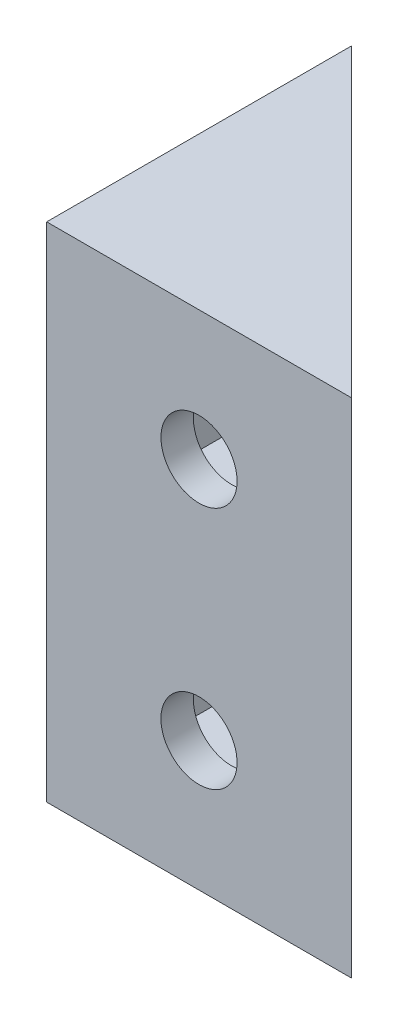
ISO-10303-21;
HEADER;
FILE_DESCRIPTION(('STEP AP214'),'2;1');
FILE_NAME('part.step','',(''),(''),'','','');
FILE_SCHEMA(('AUTOMOTIVE_DESIGN { 1 0 10303 214 1 1 1 1 }'));
ENDSEC;
DATA;
#1=APPLICATION_CONTEXT('core data for automotive mechanical design processes');
#2=APPLICATION_PROTOCOL_DEFINITION('international standard','automotive_design',2000,#1);
#3=PRODUCT_CONTEXT('',#1,'mechanical');
#4=PRODUCT('Part','Part','',(#3));
#5=PRODUCT_RELATED_PRODUCT_CATEGORY('part','',(#4));
#6=PRODUCT_DEFINITION_FORMATION('','',#4);
#7=PRODUCT_DEFINITION_CONTEXT('part definition',#1,'design');
#8=PRODUCT_DEFINITION('design','',#6,#7);
#9=PRODUCT_DEFINITION_SHAPE('','',#8);
#10=(LENGTH_UNIT() NAMED_UNIT(*) SI_UNIT(.MILLI.,.METRE.));
#11=(NAMED_UNIT(*) PLANE_ANGLE_UNIT() SI_UNIT($,.RADIAN.));
#12=(NAMED_UNIT(*) SI_UNIT($,.STERADIAN.) SOLID_ANGLE_UNIT());
#13=UNCERTAINTY_MEASURE_WITH_UNIT(LENGTH_MEASURE(1.E-05),#10,'distance_accuracy_value','');
#14=(GEOMETRIC_REPRESENTATION_CONTEXT(3) GLOBAL_UNCERTAINTY_ASSIGNED_CONTEXT((#13)) GLOBAL_UNIT_ASSIGNED_CONTEXT((#10,
#11,#12)) REPRESENTATION_CONTEXT('',''));
#15=CARTESIAN_POINT('',(0.,0.,0.));
#16=DIRECTION('',(0.,0.,1.));
#17=DIRECTION('',(1.,0.,0.));
#18=AXIS2_PLACEMENT_3D('',#15,#16,#17);
#19=CARTESIAN_POINT('',(3.,-16.5,-3.));
#20=DIRECTION('',(1.,0.,0.));
#21=DIRECTION('',(0.,0.,-1.));
#22=AXIS2_PLACEMENT_3D('',#19,#20,#21);
#23=PLANE('',#22);
#24=CARTESIAN_POINT('',(3.,8.,-10.));
#25=DIRECTION('',(1.,0.,0.));
#26=DIRECTION('',(0.,0.,-1.));
#27=AXIS2_PLACEMENT_3D('',#24,#25,#26);
#28=CIRCLE('',#27,4.00000000000002);
#29=CARTESIAN_POINT('',(3.,8.,-14.));
#30=VERTEX_POINT('',#29);
#31=EDGE_CURVE('E11',#30,#30,#28,.F.);
#32=ORIENTED_EDGE('',*,*,#31,.T.);
#33=EDGE_LOOP('',(#32));
#34=FACE_BOUND('',#33,.T.);
#35=DIRECTION('',(0.,1.,0.));
#36=VECTOR('',#35,1.);
#37=CARTESIAN_POINT('',(3.,-16.5,-3.));
#38=LINE('',#37,#36);
#39=CARTESIAN_POINT('',(3.,1.5,-3.));
#40=VERTEX_POINT('',#39);
#41=CARTESIAN_POINT('',(3.,13.5,-3.));
#42=VERTEX_POINT('',#41);
#43=EDGE_CURVE('E131',#40,#42,#38,.T.);
#44=ORIENTED_EDGE('',*,*,#43,.F.);
#45=DIRECTION('',(0.,0.,-1.));
#46=VECTOR('',#45,1.);
#47=CARTESIAN_POINT('',(3.,1.5,-3.));
#48=LINE('',#47,#46);
#49=CARTESIAN_POINT('',(3.,1.5,-17.));
#50=VERTEX_POINT('',#49);
#51=EDGE_CURVE('E50',#40,#50,#48,.T.);
#52=ORIENTED_EDGE('',*,*,#51,.T.);
#53=DIRECTION('',(0.,1.,0.));
#54=VECTOR('',#53,1.);
#55=CARTESIAN_POINT('',(3.,-16.5,-17.));
#56=LINE('',#55,#54);
#57=CARTESIAN_POINT('',(3.,13.5,-17.));
#58=VERTEX_POINT('',#57);
#59=EDGE_CURVE('E120',#50,#58,#56,.T.);
#60=ORIENTED_EDGE('',*,*,#59,.T.);
#61=DIRECTION('',(0.,0.,1.));
#62=VECTOR('',#61,1.);
#63=CARTESIAN_POINT('',(3.,13.5,-3.));
#64=LINE('',#63,#62);
#65=EDGE_CURVE('E209',#58,#42,#64,.T.);
#66=ORIENTED_EDGE('',*,*,#65,.T.);
#67=EDGE_LOOP('',(#44,#52,#60,#66));
#68=FACE_BOUND('',#67,.T.);
#69=ADVANCED_FACE('F35',(#34,#68),#23,.T.);
#70=CARTESIAN_POINT('',(17.,-16.5,-3.));
#71=DIRECTION('',(0.,0.,-1.));
#72=DIRECTION('',(-1.,0.,0.));
#73=AXIS2_PLACEMENT_3D('',#70,#71,#72);
#74=PLANE('',#73);
#75=CARTESIAN_POINT('',(10.,8.,-3.));
#76=DIRECTION('',(0.,0.,-1.));
#77=DIRECTION('',(-1.,0.,0.));
#78=AXIS2_PLACEMENT_3D('',#75,#76,#77);
#79=CIRCLE('',#78,4.);
#80=CARTESIAN_POINT('',(6.,8.,-3.));
#81=VERTEX_POINT('',#80);
#82=EDGE_CURVE('E141',#81,#81,#79,.F.);
#83=ORIENTED_EDGE('',*,*,#82,.T.);
#84=EDGE_LOOP('',(#83));
#85=FACE_BOUND('',#84,.T.);
#86=DIRECTION('',(0.,1.,0.));
#87=VECTOR('',#86,1.);
#88=CARTESIAN_POINT('',(17.,-16.5,-3.));
#89=LINE('',#88,#87);
#90=CARTESIAN_POINT('',(17.,1.5,-3.00000000000001));
#91=VERTEX_POINT('',#90);
#92=CARTESIAN_POINT('',(17.,13.5,-3.00000000000002));
#93=VERTEX_POINT('',#92);
#94=EDGE_CURVE('E118',#91,#93,#89,.T.);
#95=ORIENTED_EDGE('',*,*,#94,.F.);
#96=DIRECTION('',(-1.,0.,0.));
#97=VECTOR('',#96,1.);
#98=CARTESIAN_POINT('',(17.,1.5,-3.));
#99=LINE('',#98,#97);
#100=EDGE_CURVE('E104',#91,#40,#99,.T.);
#101=ORIENTED_EDGE('',*,*,#100,.T.);
#102=ORIENTED_EDGE('',*,*,#43,.T.);
#103=DIRECTION('',(1.,0.,0.));
#104=VECTOR('',#103,1.);
#105=CARTESIAN_POINT('',(17.,13.5,-3.));
#106=LINE('',#105,#104);
#107=EDGE_CURVE('E126',#42,#93,#106,.T.);
#108=ORIENTED_EDGE('',*,*,#107,.T.);
#109=EDGE_LOOP('',(#95,#101,#102,#108));
#110=FACE_BOUND('',#109,.T.);
#111=ADVANCED_FACE('F124',(#85,#110),#74,.T.);
#112=CARTESIAN_POINT('',(3.,-8.,-10.));
#113=DIRECTION('',(1.,0.,0.));
#114=DIRECTION('',(0.,0.,-1.));
#115=AXIS2_PLACEMENT_3D('',#112,#113,#114);
#116=CIRCLE('',#115,4.00000000000002);
#117=CARTESIAN_POINT('',(3.,-8.,-14.));
#118=VERTEX_POINT('',#117);
#119=EDGE_CURVE('E154',#118,#118,#116,.F.);
#120=ORIENTED_EDGE('',*,*,#119,.T.);
#121=EDGE_LOOP('',(#120));
#122=FACE_BOUND('',#121,.T.);
#123=DIRECTION('',(0.,0.,-1.));
#124=VECTOR('',#123,1.);
#125=CARTESIAN_POINT('',(3.,-1.5,-3.));
#126=LINE('',#125,#124);
#127=CARTESIAN_POINT('',(3.,-1.5,-3.));
#128=VERTEX_POINT('',#127);
#129=CARTESIAN_POINT('',(3.,-1.5,-17.));
#130=VERTEX_POINT('',#129);
#131=EDGE_CURVE('E195',#128,#130,#126,.T.);
#132=ORIENTED_EDGE('',*,*,#131,.F.);
#133=CARTESIAN_POINT('',(3.,-13.5,-3.));
#134=VERTEX_POINT('',#133);
#135=EDGE_CURVE('E135',#134,#128,#38,.T.);
#136=ORIENTED_EDGE('',*,*,#135,.F.);
#137=DIRECTION('',(0.,0.,1.));
#138=VECTOR('',#137,1.);
#139=CARTESIAN_POINT('',(3.,-13.5,-3.));
#140=LINE('',#139,#138);
#141=CARTESIAN_POINT('',(3.,-13.5,-17.));
#142=VERTEX_POINT('',#141);
#143=EDGE_CURVE('E285',#142,#134,#140,.T.);
#144=ORIENTED_EDGE('',*,*,#143,.F.);
#145=EDGE_CURVE('E198',#142,#130,#56,.T.);
#146=ORIENTED_EDGE('',*,*,#145,.T.);
#147=EDGE_LOOP('',(#132,#136,#144,#146));
#148=FACE_BOUND('',#147,.T.);
#149=ADVANCED_FACE('F174',(#122,#148),#23,.T.);
#150=CARTESIAN_POINT('',(10.,-8.,-3.));
#151=DIRECTION('',(0.,0.,-1.));
#152=DIRECTION('',(-1.,0.,0.));
#153=AXIS2_PLACEMENT_3D('',#150,#151,#152);
#154=CIRCLE('',#153,4.);
#155=CARTESIAN_POINT('',(6.,-8.,-3.));
#156=VERTEX_POINT('',#155);
#157=EDGE_CURVE('E148',#156,#156,#154,.F.);
#158=ORIENTED_EDGE('',*,*,#157,.T.);
#159=EDGE_LOOP('',(#158));
#160=FACE_BOUND('',#159,.T.);
#161=DIRECTION('',(-1.,0.,0.));
#162=VECTOR('',#161,1.);
#163=CARTESIAN_POINT('',(17.,-1.5,-3.));
#164=LINE('',#163,#162);
#165=CARTESIAN_POINT('',(17.,-1.5,-3.00000000000001));
#166=VERTEX_POINT('',#165);
#167=EDGE_CURVE('E202',#166,#128,#164,.T.);
#168=ORIENTED_EDGE('',*,*,#167,.F.);
#169=CARTESIAN_POINT('',(17.,-13.5,-3.));
#170=VERTEX_POINT('',#169);
#171=EDGE_CURVE('E127',#170,#166,#89,.T.);
#172=ORIENTED_EDGE('',*,*,#171,.F.);
#173=DIRECTION('',(1.,0.,0.));
#174=VECTOR('',#173,1.);
#175=CARTESIAN_POINT('',(17.,-13.5,-3.));
#176=LINE('',#175,#174);
#177=EDGE_CURVE('E58',#134,#170,#176,.T.);
#178=ORIENTED_EDGE('',*,*,#177,.F.);
#179=ORIENTED_EDGE('',*,*,#135,.T.);
#180=EDGE_LOOP('',(#168,#172,#178,#179));
#181=FACE_BOUND('',#180,.T.);
#182=ADVANCED_FACE('F181',(#160,#181),#74,.T.);
#183=CARTESIAN_POINT('',(0.,-16.5,0.));
#184=DIRECTION('',(0.,0.,1.));
#185=DIRECTION('',(1.,0.,0.));
#186=AXIS2_PLACEMENT_3D('',#183,#184,#185);
#187=PLANE('',#186);
#188=CARTESIAN_POINT('',(10.,-8.,0.));
#189=DIRECTION('',(0.,0.,1.));
#190=DIRECTION('',(-1.,0.,0.));
#191=AXIS2_PLACEMENT_3D('',#188,#189,#190);
#192=CIRCLE('',#191,2.5);
#193=CARTESIAN_POINT('',(7.5,-8.,0.));
#194=VERTEX_POINT('',#193);
#195=EDGE_CURVE('E271',#194,#194,#192,.T.);
#196=ORIENTED_EDGE('',*,*,#195,.F.);
#197=EDGE_LOOP('',(#196));
#198=FACE_BOUND('',#197,.T.);
#199=CARTESIAN_POINT('',(10.,8.,0.));
#200=DIRECTION('',(0.,0.,1.));
#201=DIRECTION('',(1.,0.,0.));
#202=AXIS2_PLACEMENT_3D('',#199,#200,#201);
#203=CIRCLE('',#202,2.5);
#204=CARTESIAN_POINT('',(12.5,8.,0.));
#205=VERTEX_POINT('',#204);
#206=EDGE_CURVE('E121',#205,#205,#203,.T.);
#207=ORIENTED_EDGE('',*,*,#206,.F.);
#208=EDGE_LOOP('',(#207));
#209=FACE_BOUND('',#208,.T.);
#210=DIRECTION('',(0.,1.,0.));
#211=VECTOR('',#210,1.);
#212=CARTESIAN_POINT('',(20.,-16.5,0.));
#213=LINE('',#212,#211);
#214=CARTESIAN_POINT('',(20.,-16.5,0.));
#215=VERTEX_POINT('',#214);
#216=CARTESIAN_POINT('',(20.,16.5,0.));
#217=VERTEX_POINT('',#216);
#218=EDGE_CURVE('E128',#215,#217,#213,.T.);
#219=ORIENTED_EDGE('',*,*,#218,.T.);
#220=DIRECTION('',(1.,0.,0.));
#221=VECTOR('',#220,1.);
#222=CARTESIAN_POINT('',(0.,16.5,0.));
#223=LINE('',#222,#221);
#224=CARTESIAN_POINT('',(0.,16.5,0.));
#225=VERTEX_POINT('',#224);
#226=EDGE_CURVE('E212',#225,#217,#223,.T.);
#227=ORIENTED_EDGE('',*,*,#226,.F.);
#228=DIRECTION('',(0.,1.,0.));
#229=VECTOR('',#228,1.);
#230=CARTESIAN_POINT('',(0.,-16.5,0.));
#231=LINE('',#230,#229);
#232=CARTESIAN_POINT('',(0.,-16.5,0.));
#233=VERTEX_POINT('',#232);
#234=EDGE_CURVE('E142',#233,#225,#231,.T.);
#235=ORIENTED_EDGE('',*,*,#234,.F.);
#236=DIRECTION('',(1.,0.,0.));
#237=VECTOR('',#236,1.);
#238=CARTESIAN_POINT('',(0.,-16.5,0.));
#239=LINE('',#238,#237);
#240=EDGE_CURVE('E224',#233,#215,#239,.T.);
#241=ORIENTED_EDGE('',*,*,#240,.T.);
#242=EDGE_LOOP('',(#219,#227,#235,#241));
#243=FACE_BOUND('',#242,.T.);
#244=ADVANCED_FACE('F189',(#198,#209,#243),#187,.T.);
#245=CARTESIAN_POINT('',(0.,-16.5,0.));
#246=DIRECTION('',(-1.,0.,0.));
#247=DIRECTION('',(0.,0.,1.));
#248=AXIS2_PLACEMENT_3D('',#245,#246,#247);
#249=PLANE('',#248);
#250=CARTESIAN_POINT('',(0.,-8.,-10.));
#251=DIRECTION('',(-1.,0.,0.));
#252=DIRECTION('',(0.,0.,-1.));
#253=AXIS2_PLACEMENT_3D('',#250,#251,#252);
#254=CIRCLE('',#253,2.5);
#255=CARTESIAN_POINT('',(0.,-8.,-12.5));
#256=VERTEX_POINT('',#255);
#257=EDGE_CURVE('E267',#256,#256,#254,.T.);
#258=ORIENTED_EDGE('',*,*,#257,.F.);
#259=EDGE_LOOP('',(#258));
#260=FACE_BOUND('',#259,.T.);
#261=CARTESIAN_POINT('',(0.,8.,-10.));
#262=DIRECTION('',(-1.,0.,0.));
#263=DIRECTION('',(0.,0.,1.));
#264=AXIS2_PLACEMENT_3D('',#261,#262,#263);
#265=CIRCLE('',#264,2.5);
#266=CARTESIAN_POINT('',(0.,8.,-7.5));
#267=VERTEX_POINT('',#266);
#268=EDGE_CURVE('E270',#267,#267,#265,.T.);
#269=ORIENTED_EDGE('',*,*,#268,.F.);
#270=EDGE_LOOP('',(#269));
#271=FACE_BOUND('',#270,.T.);
#272=ORIENTED_EDGE('',*,*,#234,.T.);
#273=DIRECTION('',(0.,0.,1.));
#274=VECTOR('',#273,1.);
#275=CARTESIAN_POINT('',(0.,16.5,0.));
#276=LINE('',#275,#274);
#277=CARTESIAN_POINT('',(0.,16.5,-20.));
#278=VERTEX_POINT('',#277);
#279=EDGE_CURVE('E221',#278,#225,#276,.T.);
#280=ORIENTED_EDGE('',*,*,#279,.F.);
#281=DIRECTION('',(0.,1.,0.));
#282=VECTOR('',#281,1.);
#283=CARTESIAN_POINT('',(0.,-16.5,-20.));
#284=LINE('',#283,#282);
#285=CARTESIAN_POINT('',(0.,-16.5,-20.));
#286=VERTEX_POINT('',#285);
#287=EDGE_CURVE('E232',#286,#278,#284,.T.);
#288=ORIENTED_EDGE('',*,*,#287,.F.);
#289=DIRECTION('',(0.,0.,1.));
#290=VECTOR('',#289,1.);
#291=CARTESIAN_POINT('',(0.,-16.5,0.));
#292=LINE('',#291,#290);
#293=EDGE_CURVE('E132',#286,#233,#292,.T.);
#294=ORIENTED_EDGE('',*,*,#293,.T.);
#295=EDGE_LOOP('',(#272,#280,#288,#294));
#296=FACE_BOUND('',#295,.T.);
#297=ADVANCED_FACE('F243',(#260,#271,#296),#249,.T.);
#298=CARTESIAN_POINT('',(3.,-16.5,-17.));
#299=DIRECTION('',(0.707106781186547,0.,-0.707106781186548));
#300=DIRECTION('',(-0.707106781186548,0.,-0.707106781186547));
#301=AXIS2_PLACEMENT_3D('',#298,#299,#300);
#302=PLANE('',#301);
#303=ORIENTED_EDGE('',*,*,#59,.F.);
#304=DIRECTION('',(-0.707106781186548,0.,-0.707106781186548));
#305=VECTOR('',#304,1.);
#306=CARTESIAN_POINT('',(0.,1.5,-20.));
#307=LINE('',#306,#305);
#308=EDGE_CURVE('E107',#91,#50,#307,.T.);
#309=ORIENTED_EDGE('',*,*,#308,.F.);
#310=ORIENTED_EDGE('',*,*,#94,.T.);
#311=DIRECTION('',(-0.707106781186548,0.,-0.707106781186548));
#312=VECTOR('',#311,1.);
#313=CARTESIAN_POINT('',(20.,13.5,0.));
#314=LINE('',#313,#312);
#315=EDGE_CURVE('E210',#93,#58,#314,.T.);
#316=ORIENTED_EDGE('',*,*,#315,.T.);
#317=EDGE_LOOP('',(#303,#309,#310,#316));
#318=FACE_BOUND('',#317,.T.);
#319=ORIENTED_EDGE('',*,*,#171,.T.);
#320=DIRECTION('',(-0.707106781186548,0.,-0.707106781186548));
#321=VECTOR('',#320,1.);
#322=CARTESIAN_POINT('',(0.,-1.5,-20.));
#323=LINE('',#322,#321);
#324=EDGE_CURVE('E111',#166,#130,#323,.T.);
#325=ORIENTED_EDGE('',*,*,#324,.T.);
#326=ORIENTED_EDGE('',*,*,#145,.F.);
#327=DIRECTION('',(0.707106781186548,0.,0.707106781186548));
#328=VECTOR('',#327,1.);
#329=CARTESIAN_POINT('',(20.,-13.5,0.));
#330=LINE('',#329,#328);
#331=EDGE_CURVE('E201',#142,#170,#330,.T.);
#332=ORIENTED_EDGE('',*,*,#331,.T.);
#333=EDGE_LOOP('',(#319,#325,#326,#332));
#334=FACE_BOUND('',#333,.T.);
#335=DIRECTION('',(-0.707106781186552,0.,-0.707106781186544));
#336=VECTOR('',#335,1.);
#337=CARTESIAN_POINT('',(20.,16.5,0.));
#338=LINE('',#337,#336);
#339=EDGE_CURVE('E215',#217,#278,#338,.T.);
#340=ORIENTED_EDGE('',*,*,#339,.F.);
#341=ORIENTED_EDGE('',*,*,#218,.F.);
#342=DIRECTION('',(-0.707106781186552,0.,-0.707106781186544));
#343=VECTOR('',#342,1.);
#344=CARTESIAN_POINT('',(20.,-16.5,0.));
#345=LINE('',#344,#343);
#346=EDGE_CURVE('E227',#215,#286,#345,.T.);
#347=ORIENTED_EDGE('',*,*,#346,.T.);
#348=ORIENTED_EDGE('',*,*,#287,.T.);
#349=EDGE_LOOP('',(#340,#341,#347,#348));
#350=FACE_BOUND('',#349,.T.);
#351=ADVANCED_FACE('F115',(#318,#334,#350),#302,.T.);
#352=CARTESIAN_POINT('',(0.,-16.5,0.));
#353=DIRECTION('',(0.,1.,0.));
#354=DIRECTION('',(0.,0.,1.));
#355=AXIS2_PLACEMENT_3D('',#352,#353,#354);
#356=PLANE('',#355);
#357=ORIENTED_EDGE('',*,*,#293,.F.);
#358=ORIENTED_EDGE('',*,*,#346,.F.);
#359=ORIENTED_EDGE('',*,*,#240,.F.);
#360=EDGE_LOOP('',(#357,#358,#359));
#361=FACE_BOUND('',#360,.T.);
#362=ADVANCED_FACE('F247',(#361),#356,.F.);
#363=CARTESIAN_POINT('',(0.,16.5,0.));
#364=DIRECTION('',(0.,1.,0.));
#365=DIRECTION('',(0.,0.,1.));
#366=AXIS2_PLACEMENT_3D('',#363,#364,#365);
#367=PLANE('',#366);
#368=ORIENTED_EDGE('',*,*,#339,.T.);
#369=ORIENTED_EDGE('',*,*,#279,.T.);
#370=ORIENTED_EDGE('',*,*,#226,.T.);
#371=EDGE_LOOP('',(#368,#369,#370));
#372=FACE_BOUND('',#371,.T.);
#373=ADVANCED_FACE('F241',(#372),#367,.T.);
#374=CARTESIAN_POINT('',(0.,13.5,0.));
#375=DIRECTION('',(0.,1.,0.));
#376=DIRECTION('',(0.,0.,1.));
#377=AXIS2_PLACEMENT_3D('',#374,#375,#376);
#378=PLANE('',#377);
#379=ORIENTED_EDGE('',*,*,#65,.F.);
#380=ORIENTED_EDGE('',*,*,#315,.F.);
#381=ORIENTED_EDGE('',*,*,#107,.F.);
#382=EDGE_LOOP('',(#379,#380,#381));
#383=FACE_BOUND('',#382,.T.);
#384=ADVANCED_FACE('F208',(#383),#378,.F.);
#385=CARTESIAN_POINT('',(0.,-13.5,0.));
#386=DIRECTION('',(0.,1.,0.));
#387=DIRECTION('',(0.,0.,1.));
#388=AXIS2_PLACEMENT_3D('',#385,#386,#387);
#389=PLANE('',#388);
#390=ORIENTED_EDGE('',*,*,#331,.F.);
#391=ORIENTED_EDGE('',*,*,#143,.T.);
#392=ORIENTED_EDGE('',*,*,#177,.T.);
#393=EDGE_LOOP('',(#390,#391,#392));
#394=FACE_BOUND('',#393,.T.);
#395=ADVANCED_FACE('F288',(#394),#389,.T.);
#396=CARTESIAN_POINT('',(0.,-1.5,0.));
#397=DIRECTION('',(0.,-1.,0.));
#398=DIRECTION('',(0.,0.,-1.));
#399=AXIS2_PLACEMENT_3D('',#396,#397,#398);
#400=PLANE('',#399);
#401=ORIENTED_EDGE('',*,*,#167,.T.);
#402=ORIENTED_EDGE('',*,*,#131,.T.);
#403=ORIENTED_EDGE('',*,*,#324,.F.);
#404=EDGE_LOOP('',(#401,#402,#403));
#405=FACE_BOUND('',#404,.T.);
#406=ADVANCED_FACE('F289',(#405),#400,.T.);
#407=CARTESIAN_POINT('',(0.,1.5,0.));
#408=DIRECTION('',(0.,-1.,0.));
#409=DIRECTION('',(0.,0.,-1.));
#410=AXIS2_PLACEMENT_3D('',#407,#408,#409);
#411=PLANE('',#410);
#412=ORIENTED_EDGE('',*,*,#51,.F.);
#413=ORIENTED_EDGE('',*,*,#100,.F.);
#414=ORIENTED_EDGE('',*,*,#308,.T.);
#415=EDGE_LOOP('',(#412,#413,#414));
#416=FACE_BOUND('',#415,.T.);
#417=ADVANCED_FACE('F106',(#416),#411,.F.);
#418=CARTESIAN_POINT('',(10.,8.,-20.));
#419=DIRECTION('',(0.,0.,1.));
#420=DIRECTION('',(1.,0.,0.));
#421=AXIS2_PLACEMENT_3D('',#418,#419,#420);
#422=CYLINDRICAL_SURFACE('',#421,2.5);
#423=CARTESIAN_POINT('',(10.,8.,-2.13397459621557));
#424=DIRECTION('',(0.,0.,-1.));
#425=DIRECTION('',(-1.,0.,0.));
#426=AXIS2_PLACEMENT_3D('',#423,#424,#425);
#427=CIRCLE('',#426,2.5);
#428=CARTESIAN_POINT('',(7.5,8.,-2.13397459621557));
#429=VERTEX_POINT('',#428);
#430=EDGE_CURVE('E138',#429,#429,#427,.T.);
#431=ORIENTED_EDGE('',*,*,#430,.T.);
#432=EDGE_LOOP('',(#431));
#433=FACE_BOUND('',#432,.T.);
#434=ORIENTED_EDGE('',*,*,#206,.T.);
#435=EDGE_LOOP('',(#434));
#436=FACE_BOUND('',#435,.T.);
#437=ADVANCED_FACE('F296',(#433,#436),#422,.F.);
#438=CARTESIAN_POINT('',(10.,-8.,-20.));
#439=DIRECTION('',(0.,0.,1.));
#440=DIRECTION('',(1.,0.,0.));
#441=AXIS2_PLACEMENT_3D('',#438,#439,#440);
#442=CYLINDRICAL_SURFACE('',#441,2.5);
#443=CARTESIAN_POINT('',(10.,-8.,-2.13397459621557));
#444=DIRECTION('',(0.,0.,-1.));
#445=DIRECTION('',(-1.,0.,0.));
#446=AXIS2_PLACEMENT_3D('',#443,#444,#445);
#447=CIRCLE('',#446,2.5);
#448=CARTESIAN_POINT('',(7.5,-8.,-2.13397459621557));
#449=VERTEX_POINT('',#448);
#450=EDGE_CURVE('E145',#449,#449,#447,.T.);
#451=ORIENTED_EDGE('',*,*,#450,.T.);
#452=EDGE_LOOP('',(#451));
#453=FACE_BOUND('',#452,.T.);
#454=ORIENTED_EDGE('',*,*,#195,.T.);
#455=EDGE_LOOP('',(#454));
#456=FACE_BOUND('',#455,.T.);
#457=ADVANCED_FACE('F391',(#453,#456),#442,.F.);
#458=CARTESIAN_POINT('',(20.,8.,-10.));
#459=DIRECTION('',(-1.,0.,0.));
#460=DIRECTION('',(0.,0.,1.));
#461=AXIS2_PLACEMENT_3D('',#458,#459,#460);
#462=CYLINDRICAL_SURFACE('',#461,2.5);
#463=CARTESIAN_POINT('',(2.13397459621555,8.,-10.));
#464=DIRECTION('',(1.,0.,0.));
#465=DIRECTION('',(0.,0.,-1.));
#466=AXIS2_PLACEMENT_3D('',#463,#464,#465);
#467=CIRCLE('',#466,2.5);
#468=CARTESIAN_POINT('',(2.13397459621555,8.,-12.5));
#469=VERTEX_POINT('',#468);
#470=EDGE_CURVE('E43',#469,#469,#467,.T.);
#471=ORIENTED_EDGE('',*,*,#470,.T.);
#472=EDGE_LOOP('',(#471));
#473=FACE_BOUND('',#472,.T.);
#474=ORIENTED_EDGE('',*,*,#268,.T.);
#475=EDGE_LOOP('',(#474));
#476=FACE_BOUND('',#475,.T.);
#477=ADVANCED_FACE('F159',(#473,#476),#462,.F.);
#478=CARTESIAN_POINT('',(20.,-8.,-10.));
#479=DIRECTION('',(-1.,0.,0.));
#480=DIRECTION('',(0.,0.,1.));
#481=AXIS2_PLACEMENT_3D('',#478,#479,#480);
#482=CYLINDRICAL_SURFACE('',#481,2.5);
#483=CARTESIAN_POINT('',(2.13397459621555,-8.,-10.));
#484=DIRECTION('',(1.,0.,0.));
#485=DIRECTION('',(0.,0.,-1.));
#486=AXIS2_PLACEMENT_3D('',#483,#484,#485);
#487=CIRCLE('',#486,2.5);
#488=CARTESIAN_POINT('',(2.13397459621555,-8.,-12.5));
#489=VERTEX_POINT('',#488);
#490=EDGE_CURVE('E151',#489,#489,#487,.T.);
#491=ORIENTED_EDGE('',*,*,#490,.T.);
#492=EDGE_LOOP('',(#491));
#493=FACE_BOUND('',#492,.T.);
#494=ORIENTED_EDGE('',*,*,#257,.T.);
#495=EDGE_LOOP('',(#494));
#496=FACE_BOUND('',#495,.T.);
#497=ADVANCED_FACE('F405',(#493,#496),#482,.F.);
#498=CARTESIAN_POINT('',(10.,8.,-2.13397459621557));
#499=DIRECTION('',(0.,0.,-1.));
#500=DIRECTION('',(-1.,0.,0.));
#501=AXIS2_PLACEMENT_3D('',#498,#499,#500);
#502=CONICAL_SURFACE('',#501,2.5,1.0471975511966);
#503=ORIENTED_EDGE('',*,*,#82,.F.);
#504=EDGE_LOOP('',(#503));
#505=FACE_BOUND('',#504,.T.);
#506=ORIENTED_EDGE('',*,*,#430,.F.);
#507=EDGE_LOOP('',(#506));
#508=FACE_BOUND('',#507,.T.);
#509=ADVANCED_FACE('F414',(#505,#508),#502,.F.);
#510=CARTESIAN_POINT('',(10.,-8.,-2.13397459621557));
#511=DIRECTION('',(0.,0.,-1.));
#512=DIRECTION('',(-1.,0.,0.));
#513=AXIS2_PLACEMENT_3D('',#510,#511,#512);
#514=CONICAL_SURFACE('',#513,2.5,1.0471975511966);
#515=ORIENTED_EDGE('',*,*,#157,.F.);
#516=EDGE_LOOP('',(#515));
#517=FACE_BOUND('',#516,.T.);
#518=ORIENTED_EDGE('',*,*,#450,.F.);
#519=EDGE_LOOP('',(#518));
#520=FACE_BOUND('',#519,.T.);
#521=ADVANCED_FACE('F168',(#517,#520),#514,.F.);
#522=CARTESIAN_POINT('',(2.13397459621555,-8.,-10.));
#523=DIRECTION('',(1.,0.,0.));
#524=DIRECTION('',(0.,0.,-1.));
#525=AXIS2_PLACEMENT_3D('',#522,#523,#524);
#526=CONICAL_SURFACE('',#525,2.5,1.0471975511966);
#527=ORIENTED_EDGE('',*,*,#119,.F.);
#528=EDGE_LOOP('',(#527));
#529=FACE_BOUND('',#528,.T.);
#530=ORIENTED_EDGE('',*,*,#490,.F.);
#531=EDGE_LOOP('',(#530));
#532=FACE_BOUND('',#531,.T.);
#533=ADVANCED_FACE('F163',(#529,#532),#526,.F.);
#534=CARTESIAN_POINT('',(2.13397459621555,8.,-10.));
#535=DIRECTION('',(1.,0.,0.));
#536=DIRECTION('',(0.,0.,-1.));
#537=AXIS2_PLACEMENT_3D('',#534,#535,#536);
#538=CONICAL_SURFACE('',#537,2.5,1.0471975511966);
#539=ORIENTED_EDGE('',*,*,#31,.F.);
#540=EDGE_LOOP('',(#539));
#541=FACE_BOUND('',#540,.T.);
#542=ORIENTED_EDGE('',*,*,#470,.F.);
#543=EDGE_LOOP('',(#542));
#544=FACE_BOUND('',#543,.T.);
#545=ADVANCED_FACE('F37',(#541,#544),#538,.F.);
#546=CLOSED_SHELL('',(#69,#111,#149,#182,#244,#297,#351,#362,#373,#384,#395,#406,#417,#437,#457,
#477,#497,#509,#521,#533,#545));
#547=MANIFOLD_SOLID_BREP('B2',#546);
#548=ADVANCED_BREP_SHAPE_REPRESENTATION('',(#18,#547),#14);
#549=SHAPE_DEFINITION_REPRESENTATION(#9,#548);
ENDSEC;
END-ISO-10303-21;
